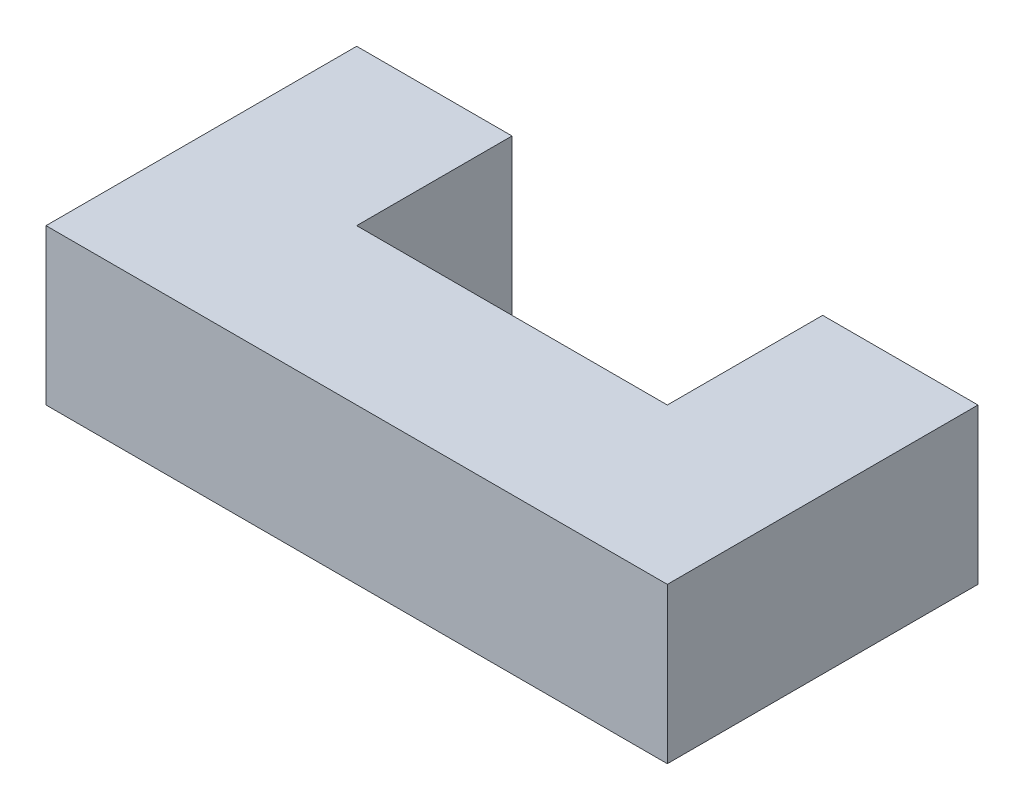
ISO-10303-21;
HEADER;
FILE_DESCRIPTION(('STEP AP214'),'2;1');
FILE_NAME('part.step','',(''),(''),'','','');
FILE_SCHEMA(('AUTOMOTIVE_DESIGN { 1 0 10303 214 1 1 1 1 }'));
ENDSEC;
DATA;
#1=APPLICATION_CONTEXT('core data for automotive mechanical design processes');
#2=APPLICATION_PROTOCOL_DEFINITION('international standard','automotive_design',2000,#1);
#3=PRODUCT_CONTEXT('',#1,'mechanical');
#4=PRODUCT('Part','Part','',(#3));
#5=PRODUCT_RELATED_PRODUCT_CATEGORY('part','',(#4));
#6=PRODUCT_DEFINITION_FORMATION('','',#4);
#7=PRODUCT_DEFINITION_CONTEXT('part definition',#1,'design');
#8=PRODUCT_DEFINITION('design','',#6,#7);
#9=PRODUCT_DEFINITION_SHAPE('','',#8);
#10=(LENGTH_UNIT() NAMED_UNIT(*) SI_UNIT(.MILLI.,.METRE.));
#11=(NAMED_UNIT(*) PLANE_ANGLE_UNIT() SI_UNIT($,.RADIAN.));
#12=(NAMED_UNIT(*) SI_UNIT($,.STERADIAN.) SOLID_ANGLE_UNIT());
#13=UNCERTAINTY_MEASURE_WITH_UNIT(LENGTH_MEASURE(1.E-05),#10,'distance_accuracy_value','');
#14=(GEOMETRIC_REPRESENTATION_CONTEXT(3) GLOBAL_UNCERTAINTY_ASSIGNED_CONTEXT((#13)) GLOBAL_UNIT_ASSIGNED_CONTEXT((#10,
#11,#12)) REPRESENTATION_CONTEXT('',''));
#15=CARTESIAN_POINT('',(0.,0.,0.));
#16=DIRECTION('',(0.,0.,1.));
#17=DIRECTION('',(1.,0.,0.));
#18=AXIS2_PLACEMENT_3D('',#15,#16,#17);
#19=CARTESIAN_POINT('',(0.,5.,-5.));
#20=DIRECTION('',(0.,0.,-1.));
#21=DIRECTION('',(-1.,0.,0.));
#22=AXIS2_PLACEMENT_3D('',#19,#20,#21);
#23=PLANE('',#22);
#24=DIRECTION('',(1.,0.,0.));
#25=VECTOR('',#24,1.);
#26=CARTESIAN_POINT('',(0.,0.,-5.));
#27=LINE('',#26,#25);
#28=CARTESIAN_POINT('',(5.,0.,-5.));
#29=VERTEX_POINT('',#28);
#30=CARTESIAN_POINT('',(10.,0.,-5.));
#31=VERTEX_POINT('',#30);
#32=EDGE_CURVE('E133',#29,#31,#27,.T.);
#33=ORIENTED_EDGE('',*,*,#32,.F.);
#34=DIRECTION('',(0.,-1.,0.));
#35=VECTOR('',#34,1.);
#36=CARTESIAN_POINT('',(5.,5.,-5.));
#37=LINE('',#36,#35);
#38=CARTESIAN_POINT('',(5.,5.,-5.));
#39=VERTEX_POINT('',#38);
#40=EDGE_CURVE('E11',#39,#29,#37,.T.);
#41=ORIENTED_EDGE('',*,*,#40,.F.);
#42=DIRECTION('',(1.,0.,0.));
#43=VECTOR('',#42,1.);
#44=CARTESIAN_POINT('',(0.,5.,-5.));
#45=LINE('',#44,#43);
#46=CARTESIAN_POINT('',(10.,5.,-5.));
#47=VERTEX_POINT('',#46);
#48=EDGE_CURVE('E128',#39,#47,#45,.T.);
#49=ORIENTED_EDGE('',*,*,#48,.T.);
#50=DIRECTION('',(0.,-1.,0.));
#51=VECTOR('',#50,1.);
#52=CARTESIAN_POINT('',(10.,5.,-5.));
#53=LINE('',#52,#51);
#54=EDGE_CURVE('E86',#47,#31,#53,.T.);
#55=ORIENTED_EDGE('',*,*,#54,.T.);
#56=EDGE_LOOP('',(#33,#41,#49,#55));
#57=FACE_BOUND('',#56,.T.);
#58=ADVANCED_FACE('F35',(#57),#23,.T.);
#59=CARTESIAN_POINT('',(5.,5.,0.));
#60=DIRECTION('',(1.,0.,0.));
#61=DIRECTION('',(0.,0.,-1.));
#62=AXIS2_PLACEMENT_3D('',#59,#60,#61);
#63=PLANE('',#62);
#64=DIRECTION('',(0.,0.,1.));
#65=VECTOR('',#64,1.);
#66=CARTESIAN_POINT('',(5.,0.,0.));
#67=LINE('',#66,#65);
#68=CARTESIAN_POINT('',(5.,0.,0.));
#69=VERTEX_POINT('',#68);
#70=EDGE_CURVE('E136',#29,#69,#67,.T.);
#71=ORIENTED_EDGE('',*,*,#70,.T.);
#72=DIRECTION('',(0.,-1.,0.));
#73=VECTOR('',#72,1.);
#74=CARTESIAN_POINT('',(5.,5.,0.));
#75=LINE('',#74,#73);
#76=CARTESIAN_POINT('',(5.,5.,0.));
#77=VERTEX_POINT('',#76);
#78=EDGE_CURVE('E44',#77,#69,#75,.T.);
#79=ORIENTED_EDGE('',*,*,#78,.F.);
#80=DIRECTION('',(0.,0.,1.));
#81=VECTOR('',#80,1.);
#82=CARTESIAN_POINT('',(5.,5.,0.));
#83=LINE('',#82,#81);
#84=EDGE_CURVE('E173',#39,#77,#83,.T.);
#85=ORIENTED_EDGE('',*,*,#84,.F.);
#86=ORIENTED_EDGE('',*,*,#40,.T.);
#87=EDGE_LOOP('',(#71,#79,#85,#86));
#88=FACE_BOUND('',#87,.T.);
#89=ADVANCED_FACE('F37',(#88),#63,.F.);
#90=CARTESIAN_POINT('',(0.,5.,0.));
#91=DIRECTION('',(0.,0.,-1.));
#92=DIRECTION('',(-1.,0.,0.));
#93=AXIS2_PLACEMENT_3D('',#90,#91,#92);
#94=PLANE('',#93);
#95=DIRECTION('',(1.,0.,0.));
#96=VECTOR('',#95,1.);
#97=CARTESIAN_POINT('',(0.,0.,0.));
#98=LINE('',#97,#96);
#99=CARTESIAN_POINT('',(-5.,0.,0.));
#100=VERTEX_POINT('',#99);
#101=EDGE_CURVE('E140',#100,#69,#98,.T.);
#102=ORIENTED_EDGE('',*,*,#101,.F.);
#103=DIRECTION('',(0.,-1.,0.));
#104=VECTOR('',#103,1.);
#105=CARTESIAN_POINT('',(-5.,5.,0.));
#106=LINE('',#105,#104);
#107=CARTESIAN_POINT('',(-5.,5.,0.));
#108=VERTEX_POINT('',#107);
#109=EDGE_CURVE('E155',#108,#100,#106,.T.);
#110=ORIENTED_EDGE('',*,*,#109,.F.);
#111=DIRECTION('',(1.,0.,0.));
#112=VECTOR('',#111,1.);
#113=CARTESIAN_POINT('',(0.,5.,0.));
#114=LINE('',#113,#112);
#115=EDGE_CURVE('E162',#108,#77,#114,.T.);
#116=ORIENTED_EDGE('',*,*,#115,.T.);
#117=ORIENTED_EDGE('',*,*,#78,.T.);
#118=EDGE_LOOP('',(#102,#110,#116,#117));
#119=FACE_BOUND('',#118,.T.);
#120=ADVANCED_FACE('F160',(#119),#94,.T.);
#121=CARTESIAN_POINT('',(-5.,5.,0.));
#122=DIRECTION('',(1.,0.,0.));
#123=DIRECTION('',(0.,0.,-1.));
#124=AXIS2_PLACEMENT_3D('',#121,#122,#123);
#125=PLANE('',#124);
#126=DIRECTION('',(0.,0.,1.));
#127=VECTOR('',#126,1.);
#128=CARTESIAN_POINT('',(-5.,0.,0.));
#129=LINE('',#128,#127);
#130=CARTESIAN_POINT('',(-5.,0.,-5.));
#131=VERTEX_POINT('',#130);
#132=EDGE_CURVE('E143',#131,#100,#129,.T.);
#133=ORIENTED_EDGE('',*,*,#132,.F.);
#134=DIRECTION('',(0.,-1.,0.));
#135=VECTOR('',#134,1.);
#136=CARTESIAN_POINT('',(-5.,5.,-5.));
#137=LINE('',#136,#135);
#138=CARTESIAN_POINT('',(-5.,5.,-5.));
#139=VERTEX_POINT('',#138);
#140=EDGE_CURVE('E153',#139,#131,#137,.T.);
#141=ORIENTED_EDGE('',*,*,#140,.F.);
#142=DIRECTION('',(0.,0.,1.));
#143=VECTOR('',#142,1.);
#144=CARTESIAN_POINT('',(-5.,5.,0.));
#145=LINE('',#144,#143);
#146=EDGE_CURVE('E126',#139,#108,#145,.T.);
#147=ORIENTED_EDGE('',*,*,#146,.T.);
#148=ORIENTED_EDGE('',*,*,#109,.T.);
#149=EDGE_LOOP('',(#133,#141,#147,#148));
#150=FACE_BOUND('',#149,.T.);
#151=ADVANCED_FACE('F171',(#150),#125,.T.);
#152=CARTESIAN_POINT('',(-10.,0.,-5.));
#153=VERTEX_POINT('',#152);
#154=EDGE_CURVE('E137',#153,#131,#27,.T.);
#155=ORIENTED_EDGE('',*,*,#154,.F.);
#156=DIRECTION('',(0.,-1.,0.));
#157=VECTOR('',#156,1.);
#158=CARTESIAN_POINT('',(-10.,5.,-5.));
#159=LINE('',#158,#157);
#160=CARTESIAN_POINT('',(-10.,5.,-5.));
#161=VERTEX_POINT('',#160);
#162=EDGE_CURVE('E114',#161,#153,#159,.T.);
#163=ORIENTED_EDGE('',*,*,#162,.F.);
#164=EDGE_CURVE('E124',#161,#139,#45,.T.);
#165=ORIENTED_EDGE('',*,*,#164,.T.);
#166=ORIENTED_EDGE('',*,*,#140,.T.);
#167=EDGE_LOOP('',(#155,#163,#165,#166));
#168=FACE_BOUND('',#167,.T.);
#169=ADVANCED_FACE('F177',(#168),#23,.T.);
#170=CARTESIAN_POINT('',(-10.,5.,0.));
#171=DIRECTION('',(-1.,0.,0.));
#172=DIRECTION('',(0.,0.,1.));
#173=AXIS2_PLACEMENT_3D('',#170,#171,#172);
#174=PLANE('',#173);
#175=DIRECTION('',(0.,0.,-1.));
#176=VECTOR('',#175,1.);
#177=CARTESIAN_POINT('',(-10.,0.,0.));
#178=LINE('',#177,#176);
#179=CARTESIAN_POINT('',(-10.,0.,5.));
#180=VERTEX_POINT('',#179);
#181=EDGE_CURVE('E113',#180,#153,#178,.T.);
#182=ORIENTED_EDGE('',*,*,#181,.F.);
#183=DIRECTION('',(0.,-1.,0.));
#184=VECTOR('',#183,1.);
#185=CARTESIAN_POINT('',(-10.,5.,5.));
#186=LINE('',#185,#184);
#187=CARTESIAN_POINT('',(-10.,5.,5.));
#188=VERTEX_POINT('',#187);
#189=EDGE_CURVE('E107',#188,#180,#186,.T.);
#190=ORIENTED_EDGE('',*,*,#189,.F.);
#191=DIRECTION('',(0.,0.,-1.));
#192=VECTOR('',#191,1.);
#193=CARTESIAN_POINT('',(-10.,5.,0.));
#194=LINE('',#193,#192);
#195=EDGE_CURVE('E111',#188,#161,#194,.T.);
#196=ORIENTED_EDGE('',*,*,#195,.T.);
#197=ORIENTED_EDGE('',*,*,#162,.T.);
#198=EDGE_LOOP('',(#182,#190,#196,#197));
#199=FACE_BOUND('',#198,.T.);
#200=ADVANCED_FACE('F109',(#199),#174,.T.);
#201=CARTESIAN_POINT('',(0.,5.,5.));
#202=DIRECTION('',(0.,0.,-1.));
#203=DIRECTION('',(-1.,0.,0.));
#204=AXIS2_PLACEMENT_3D('',#201,#202,#203);
#205=PLANE('',#204);
#206=DIRECTION('',(1.,0.,0.));
#207=VECTOR('',#206,1.);
#208=CARTESIAN_POINT('',(0.,0.,5.));
#209=LINE('',#208,#207);
#210=CARTESIAN_POINT('',(10.,0.,5.));
#211=VERTEX_POINT('',#210);
#212=EDGE_CURVE('E79',#180,#211,#209,.T.);
#213=ORIENTED_EDGE('',*,*,#212,.T.);
#214=DIRECTION('',(0.,-1.,0.));
#215=VECTOR('',#214,1.);
#216=CARTESIAN_POINT('',(10.,5.,5.));
#217=LINE('',#216,#215);
#218=CARTESIAN_POINT('',(10.,5.,5.));
#219=VERTEX_POINT('',#218);
#220=EDGE_CURVE('E115',#219,#211,#217,.T.);
#221=ORIENTED_EDGE('',*,*,#220,.F.);
#222=DIRECTION('',(1.,0.,0.));
#223=VECTOR('',#222,1.);
#224=CARTESIAN_POINT('',(0.,5.,5.));
#225=LINE('',#224,#223);
#226=EDGE_CURVE('E117',#188,#219,#225,.T.);
#227=ORIENTED_EDGE('',*,*,#226,.F.);
#228=ORIENTED_EDGE('',*,*,#189,.T.);
#229=EDGE_LOOP('',(#213,#221,#227,#228));
#230=FACE_BOUND('',#229,.T.);
#231=ADVANCED_FACE('F118',(#230),#205,.F.);
#232=CARTESIAN_POINT('',(10.,5.,0.));
#233=DIRECTION('',(-1.,0.,0.));
#234=DIRECTION('',(0.,0.,1.));
#235=AXIS2_PLACEMENT_3D('',#232,#233,#234);
#236=PLANE('',#235);
#237=DIRECTION('',(0.,0.,-1.));
#238=VECTOR('',#237,1.);
#239=CARTESIAN_POINT('',(10.,0.,0.));
#240=LINE('',#239,#238);
#241=EDGE_CURVE('E148',#211,#31,#240,.T.);
#242=ORIENTED_EDGE('',*,*,#241,.T.);
#243=ORIENTED_EDGE('',*,*,#54,.F.);
#244=DIRECTION('',(0.,0.,-1.));
#245=VECTOR('',#244,1.);
#246=CARTESIAN_POINT('',(10.,5.,0.));
#247=LINE('',#246,#245);
#248=EDGE_CURVE('E52',#219,#47,#247,.T.);
#249=ORIENTED_EDGE('',*,*,#248,.F.);
#250=ORIENTED_EDGE('',*,*,#220,.T.);
#251=EDGE_LOOP('',(#242,#243,#249,#250));
#252=FACE_BOUND('',#251,.T.);
#253=ADVANCED_FACE('F191',(#252),#236,.F.);
#254=CARTESIAN_POINT('',(0.,5.,0.));
#255=DIRECTION('',(0.,1.,0.));
#256=DIRECTION('',(0.,0.,1.));
#257=AXIS2_PLACEMENT_3D('',#254,#255,#256);
#258=PLANE('',#257);
#259=ORIENTED_EDGE('',*,*,#48,.F.);
#260=ORIENTED_EDGE('',*,*,#84,.T.);
#261=ORIENTED_EDGE('',*,*,#115,.F.);
#262=ORIENTED_EDGE('',*,*,#146,.F.);
#263=ORIENTED_EDGE('',*,*,#164,.F.);
#264=ORIENTED_EDGE('',*,*,#195,.F.);
#265=ORIENTED_EDGE('',*,*,#226,.T.);
#266=ORIENTED_EDGE('',*,*,#248,.T.);
#267=EDGE_LOOP('',(#259,#260,#261,#262,#263,#264,#265,#266));
#268=FACE_BOUND('',#267,.T.);
#269=ADVANCED_FACE('F121',(#268),#258,.T.);
#270=CARTESIAN_POINT('',(0.,0.,0.));
#271=DIRECTION('',(0.,1.,0.));
#272=DIRECTION('',(0.,0.,1.));
#273=AXIS2_PLACEMENT_3D('',#270,#271,#272);
#274=PLANE('',#273);
#275=ORIENTED_EDGE('',*,*,#32,.T.);
#276=ORIENTED_EDGE('',*,*,#241,.F.);
#277=ORIENTED_EDGE('',*,*,#212,.F.);
#278=ORIENTED_EDGE('',*,*,#181,.T.);
#279=ORIENTED_EDGE('',*,*,#154,.T.);
#280=ORIENTED_EDGE('',*,*,#132,.T.);
#281=ORIENTED_EDGE('',*,*,#101,.T.);
#282=ORIENTED_EDGE('',*,*,#70,.F.);
#283=EDGE_LOOP('',(#275,#276,#277,#278,#279,#280,#281,#282));
#284=FACE_BOUND('',#283,.T.);
#285=ADVANCED_FACE('F166',(#284),#274,.F.);
#286=CLOSED_SHELL('',(#58,#89,#120,#151,#169,#200,#231,#253,#269,#285));
#287=MANIFOLD_SOLID_BREP('B2',#286);
#288=ADVANCED_BREP_SHAPE_REPRESENTATION('',(#18,#287),#14);
#289=SHAPE_DEFINITION_REPRESENTATION(#9,#288);
ENDSEC;
END-ISO-10303-21;
